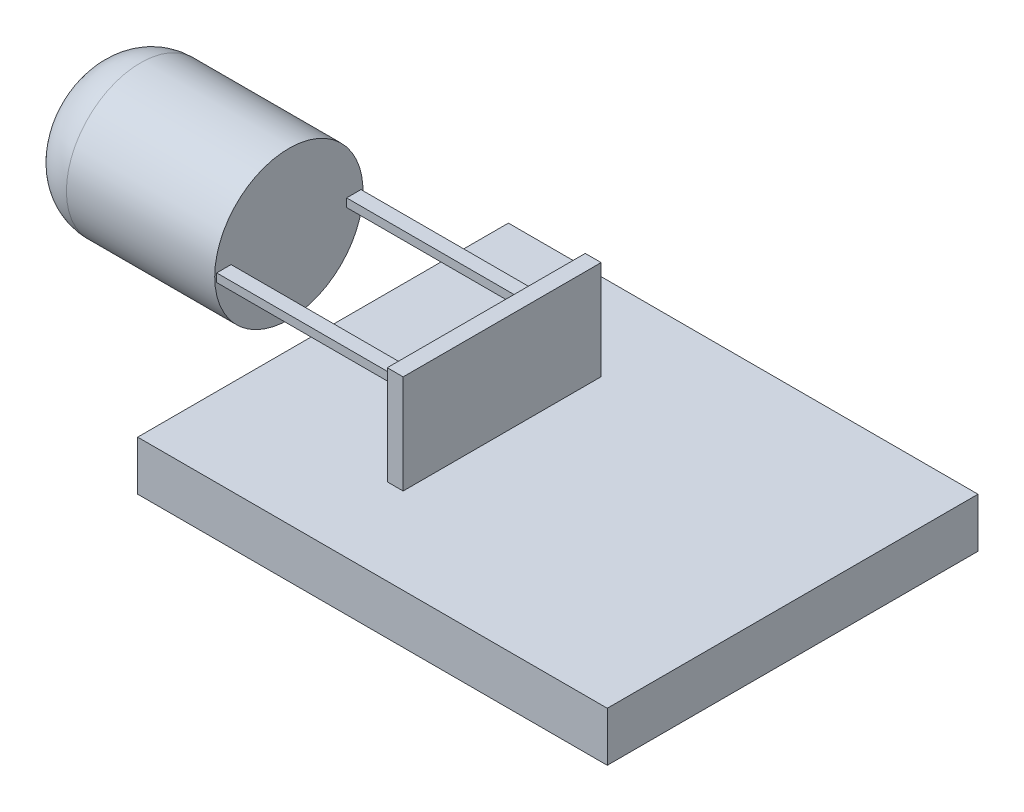
ISO-10303-21;
HEADER;
FILE_DESCRIPTION(('STEP AP214'),'2;1');
FILE_NAME('part.step','',(''),(''),'','','');
FILE_SCHEMA(('AUTOMOTIVE_DESIGN { 1 0 10303 214 1 1 1 1 }'));
ENDSEC;
DATA;
#1=APPLICATION_CONTEXT('core data for automotive mechanical design processes');
#2=APPLICATION_PROTOCOL_DEFINITION('international standard','automotive_design',2000,#1);
#3=PRODUCT_CONTEXT('',#1,'mechanical');
#4=PRODUCT('Part','Part','',(#3));
#5=PRODUCT_RELATED_PRODUCT_CATEGORY('part','',(#4));
#6=PRODUCT_DEFINITION_FORMATION('','',#4);
#7=PRODUCT_DEFINITION_CONTEXT('part definition',#1,'design');
#8=PRODUCT_DEFINITION('design','',#6,#7);
#9=PRODUCT_DEFINITION_SHAPE('','',#8);
#10=(LENGTH_UNIT() NAMED_UNIT(*) SI_UNIT(.MILLI.,.METRE.));
#11=(NAMED_UNIT(*) PLANE_ANGLE_UNIT() SI_UNIT($,.RADIAN.));
#12=(NAMED_UNIT(*) SI_UNIT($,.STERADIAN.) SOLID_ANGLE_UNIT());
#13=UNCERTAINTY_MEASURE_WITH_UNIT(LENGTH_MEASURE(1.E-05),#10,'distance_accuracy_value','');
#14=(GEOMETRIC_REPRESENTATION_CONTEXT(3) GLOBAL_UNCERTAINTY_ASSIGNED_CONTEXT((#13)) GLOBAL_UNIT_ASSIGNED_CONTEXT((#10,
#11,#12)) REPRESENTATION_CONTEXT('',''));
#15=CARTESIAN_POINT('',(0.,0.,0.));
#16=DIRECTION('',(0.,0.,1.));
#17=DIRECTION('',(1.,0.,0.));
#18=AXIS2_PLACEMENT_3D('',#15,#16,#17);
#19=CARTESIAN_POINT('',(-2.8834257747241,6.,4.01836179610576));
#20=DIRECTION('',(1.,0.,0.));
#21=DIRECTION('',(0.,0.,-1.));
#22=AXIS2_PLACEMENT_3D('',#19,#20,#21);
#23=PLANE('',#22);
#24=DIRECTION('',(0.,0.,1.));
#25=VECTOR('',#24,1.);
#26=CARTESIAN_POINT('',(-2.8834257747241,4.77290766753286,2.91860664881381));
#27=LINE('',#26,#25);
#28=CARTESIAN_POINT('',(-2.8834257747241,4.77290766753286,2.33811029877349));
#29=VERTEX_POINT('',#28);
#30=CARTESIAN_POINT('',(-2.8834257747241,4.77290766753286,2.91860664881381));
#31=VERTEX_POINT('',#30);
#32=EDGE_CURVE('E196',#29,#31,#27,.T.);
#33=ORIENTED_EDGE('',*,*,#32,.T.);
#34=DIRECTION('',(0.,-1.,0.));
#35=VECTOR('',#34,1.);
#36=CARTESIAN_POINT('',(-2.8834257747241,4.77290766753286,2.91860664881381));
#37=LINE('',#36,#35);
#38=CARTESIAN_POINT('',(-2.8834257747241,4.434284796676,2.91860664881381));
#39=VERTEX_POINT('',#38);
#40=EDGE_CURVE('E193',#31,#39,#37,.T.);
#41=ORIENTED_EDGE('',*,*,#40,.T.);
#42=DIRECTION('',(0.,0.,-1.));
#43=VECTOR('',#42,1.);
#44=CARTESIAN_POINT('',(-2.8834257747241,4.434284796676,2.91860664881381));
#45=LINE('',#44,#43);
#46=CARTESIAN_POINT('',(-2.8834257747241,4.434284796676,2.33811029877349));
#47=VERTEX_POINT('',#46);
#48=EDGE_CURVE('E171',#39,#47,#45,.T.);
#49=ORIENTED_EDGE('',*,*,#48,.T.);
#50=DIRECTION('',(0.,1.,0.));
#51=VECTOR('',#50,1.);
#52=CARTESIAN_POINT('',(-2.8834257747241,4.77290766753286,2.33811029877349));
#53=LINE('',#52,#51);
#54=EDGE_CURVE('E57',#47,#29,#53,.T.);
#55=ORIENTED_EDGE('',*,*,#54,.T.);
#56=EDGE_LOOP('',(#33,#41,#49,#55));
#57=FACE_BOUND('',#56,.T.);
#58=DIRECTION('',(0.,0.,1.));
#59=VECTOR('',#58,1.);
#60=CARTESIAN_POINT('',(-2.8834257747241,2.,4.01836179610576));
#61=LINE('',#60,#59);
#62=CARTESIAN_POINT('',(-2.8834257747241,2.,-3.99281168269362));
#63=VERTEX_POINT('',#62);
#64=CARTESIAN_POINT('',(-2.8834257747241,2.,4.01836179610576));
#65=VERTEX_POINT('',#64);
#66=EDGE_CURVE('E254',#63,#65,#61,.T.);
#67=ORIENTED_EDGE('',*,*,#66,.T.);
#68=DIRECTION('',(0.,-1.,0.));
#69=VECTOR('',#68,1.);
#70=CARTESIAN_POINT('',(-2.8834257747241,6.,4.01836179610576));
#71=LINE('',#70,#69);
#72=CARTESIAN_POINT('',(-2.8834257747241,6.,4.01836179610576));
#73=VERTEX_POINT('',#72);
#74=EDGE_CURVE('E292',#73,#65,#71,.T.);
#75=ORIENTED_EDGE('',*,*,#74,.F.);
#76=DIRECTION('',(0.,0.,1.));
#77=VECTOR('',#76,1.);
#78=CARTESIAN_POINT('',(-2.8834257747241,6.,4.01836179610576));
#79=LINE('',#78,#77);
#80=CARTESIAN_POINT('',(-2.8834257747241,6.,-3.99281168269362));
#81=VERTEX_POINT('',#80);
#82=EDGE_CURVE('E255',#81,#73,#79,.T.);
#83=ORIENTED_EDGE('',*,*,#82,.F.);
#84=DIRECTION('',(0.,-1.,0.));
#85=VECTOR('',#84,1.);
#86=CARTESIAN_POINT('',(-2.8834257747241,6.,-3.99281168269362));
#87=LINE('',#86,#85);
#88=EDGE_CURVE('E269',#81,#63,#87,.T.);
#89=ORIENTED_EDGE('',*,*,#88,.T.);
#90=EDGE_LOOP('',(#67,#75,#83,#89));
#91=FACE_BOUND('',#90,.T.);
#92=DIRECTION('',(0.,-1.,0.));
#93=VECTOR('',#92,1.);
#94=CARTESIAN_POINT('',(-2.8834257747241,4.77290766753286,-2.91860664881381));
#95=LINE('',#94,#93);
#96=CARTESIAN_POINT('',(-2.8834257747241,4.77290766753286,-2.91860664881381));
#97=VERTEX_POINT('',#96);
#98=CARTESIAN_POINT('',(-2.8834257747241,4.434284796676,-2.91860664881381));
#99=VERTEX_POINT('',#98);
#100=EDGE_CURVE('E209',#97,#99,#95,.T.);
#101=ORIENTED_EDGE('',*,*,#100,.F.);
#102=DIRECTION('',(0.,0.,-1.));
#103=VECTOR('',#102,1.);
#104=CARTESIAN_POINT('',(-2.8834257747241,4.77290766753286,-2.91860664881381));
#105=LINE('',#104,#103);
#106=CARTESIAN_POINT('',(-2.8834257747241,4.77290766753286,-2.33811029877349));
#107=VERTEX_POINT('',#106);
#108=EDGE_CURVE('E215',#107,#97,#105,.T.);
#109=ORIENTED_EDGE('',*,*,#108,.F.);
#110=DIRECTION('',(0.,1.,0.));
#111=VECTOR('',#110,1.);
#112=CARTESIAN_POINT('',(-2.8834257747241,4.77290766753286,-2.33811029877349));
#113=LINE('',#112,#111);
#114=CARTESIAN_POINT('',(-2.8834257747241,4.434284796676,-2.33811029877349));
#115=VERTEX_POINT('',#114);
#116=EDGE_CURVE('E233',#115,#107,#113,.T.);
#117=ORIENTED_EDGE('',*,*,#116,.F.);
#118=DIRECTION('',(0.,0.,1.));
#119=VECTOR('',#118,1.);
#120=CARTESIAN_POINT('',(-2.8834257747241,4.434284796676,-2.91860664881381));
#121=LINE('',#120,#119);
#122=EDGE_CURVE('E65',#99,#115,#121,.T.);
#123=ORIENTED_EDGE('',*,*,#122,.F.);
#124=EDGE_LOOP('',(#101,#109,#117,#123));
#125=FACE_BOUND('',#124,.T.);
#126=ADVANCED_FACE('F41',(#57,#91,#125),#23,.F.);
#127=CARTESIAN_POINT('',(0.,2.,0.));
#128=DIRECTION('',(0.,1.,0.));
#129=DIRECTION('',(0.,0.,1.));
#130=AXIS2_PLACEMENT_3D('',#127,#128,#129);
#131=PLANE('',#130);
#132=DIRECTION('',(0.,0.,-1.));
#133=VECTOR('',#132,1.);
#134=CARTESIAN_POINT('',(9.5,2.,-7.5));
#135=LINE('',#134,#133);
#136=CARTESIAN_POINT('',(9.5,2.,7.5));
#137=VERTEX_POINT('',#136);
#138=CARTESIAN_POINT('',(9.5,2.,-7.5));
#139=VERTEX_POINT('',#138);
#140=EDGE_CURVE('E296',#137,#139,#135,.T.);
#141=ORIENTED_EDGE('',*,*,#140,.T.);
#142=DIRECTION('',(-1.,0.,0.));
#143=VECTOR('',#142,1.);
#144=CARTESIAN_POINT('',(-9.5,2.,-7.5));
#145=LINE('',#144,#143);
#146=CARTESIAN_POINT('',(-9.5,2.,-7.5));
#147=VERTEX_POINT('',#146);
#148=EDGE_CURVE('E300',#139,#147,#145,.T.);
#149=ORIENTED_EDGE('',*,*,#148,.T.);
#150=DIRECTION('',(0.,0.,1.));
#151=VECTOR('',#150,1.);
#152=CARTESIAN_POINT('',(-9.5,2.,-7.5));
#153=LINE('',#152,#151);
#154=CARTESIAN_POINT('',(-9.5,2.,7.5));
#155=VERTEX_POINT('',#154);
#156=EDGE_CURVE('E304',#147,#155,#153,.T.);
#157=ORIENTED_EDGE('',*,*,#156,.T.);
#158=DIRECTION('',(1.,0.,0.));
#159=VECTOR('',#158,1.);
#160=CARTESIAN_POINT('',(-9.5,2.,7.5));
#161=LINE('',#160,#159);
#162=EDGE_CURVE('E307',#155,#137,#161,.T.);
#163=ORIENTED_EDGE('',*,*,#162,.T.);
#164=EDGE_LOOP('',(#141,#149,#157,#163));
#165=FACE_BOUND('',#164,.T.);
#166=DIRECTION('',(1.,0.,0.));
#167=VECTOR('',#166,1.);
#168=CARTESIAN_POINT('',(-2.8834257747241,2.,4.01836179610576));
#169=LINE('',#168,#167);
#170=CARTESIAN_POINT('',(-2.24092564609859,2.,4.01836179610576));
#171=VERTEX_POINT('',#170);
#172=EDGE_CURVE('E273',#65,#171,#169,.T.);
#173=ORIENTED_EDGE('',*,*,#172,.F.);
#174=ORIENTED_EDGE('',*,*,#66,.F.);
#175=DIRECTION('',(-1.,0.,0.));
#176=VECTOR('',#175,1.);
#177=CARTESIAN_POINT('',(-2.8834257747241,2.,-3.99281168269362));
#178=LINE('',#177,#176);
#179=CARTESIAN_POINT('',(-2.24092564609859,2.,-3.99281168269362));
#180=VERTEX_POINT('',#179);
#181=EDGE_CURVE('E260',#180,#63,#178,.T.);
#182=ORIENTED_EDGE('',*,*,#181,.F.);
#183=DIRECTION('',(0.,0.,-1.));
#184=VECTOR('',#183,1.);
#185=CARTESIAN_POINT('',(-2.24092564609859,2.,4.01836179610576));
#186=LINE('',#185,#184);
#187=EDGE_CURVE('E276',#171,#180,#186,.T.);
#188=ORIENTED_EDGE('',*,*,#187,.F.);
#189=EDGE_LOOP('',(#173,#174,#182,#188));
#190=FACE_BOUND('',#189,.T.);
#191=ADVANCED_FACE('F351',(#165,#190),#131,.T.);
#192=CARTESIAN_POINT('',(9.5,2.,-7.5));
#193=DIRECTION('',(-1.,0.,0.));
#194=DIRECTION('',(0.,0.,1.));
#195=AXIS2_PLACEMENT_3D('',#192,#193,#194);
#196=PLANE('',#195);
#197=DIRECTION('',(0.,0.,-1.));
#198=VECTOR('',#197,1.);
#199=CARTESIAN_POINT('',(9.5,0.,-7.5));
#200=LINE('',#199,#198);
#201=CARTESIAN_POINT('',(9.5,0.,7.5));
#202=VERTEX_POINT('',#201);
#203=CARTESIAN_POINT('',(9.5,0.,-7.5));
#204=VERTEX_POINT('',#203);
#205=EDGE_CURVE('E295',#202,#204,#200,.T.);
#206=ORIENTED_EDGE('',*,*,#205,.T.);
#207=DIRECTION('',(0.,-1.,0.));
#208=VECTOR('',#207,1.);
#209=CARTESIAN_POINT('',(9.5,2.,-7.5));
#210=LINE('',#209,#208);
#211=EDGE_CURVE('E333',#139,#204,#210,.T.);
#212=ORIENTED_EDGE('',*,*,#211,.F.);
#213=ORIENTED_EDGE('',*,*,#140,.F.);
#214=DIRECTION('',(0.,-1.,0.));
#215=VECTOR('',#214,1.);
#216=CARTESIAN_POINT('',(9.5,2.,7.5));
#217=LINE('',#216,#215);
#218=EDGE_CURVE('E310',#137,#202,#217,.T.);
#219=ORIENTED_EDGE('',*,*,#218,.T.);
#220=EDGE_LOOP('',(#206,#212,#213,#219));
#221=FACE_BOUND('',#220,.T.);
#222=ADVANCED_FACE('F357',(#221),#196,.F.);
#223=CARTESIAN_POINT('',(-9.5,2.,-7.5));
#224=DIRECTION('',(0.,0.,1.));
#225=DIRECTION('',(1.,0.,0.));
#226=AXIS2_PLACEMENT_3D('',#223,#224,#225);
#227=PLANE('',#226);
#228=DIRECTION('',(-1.,0.,0.));
#229=VECTOR('',#228,1.);
#230=CARTESIAN_POINT('',(-9.5,0.,-7.5));
#231=LINE('',#230,#229);
#232=CARTESIAN_POINT('',(-9.5,0.,-7.5));
#233=VERTEX_POINT('',#232);
#234=EDGE_CURVE('E314',#204,#233,#231,.T.);
#235=ORIENTED_EDGE('',*,*,#234,.T.);
#236=DIRECTION('',(0.,-1.,0.));
#237=VECTOR('',#236,1.);
#238=CARTESIAN_POINT('',(-9.5,2.,-7.5));
#239=LINE('',#238,#237);
#240=EDGE_CURVE('E329',#147,#233,#239,.T.);
#241=ORIENTED_EDGE('',*,*,#240,.F.);
#242=ORIENTED_EDGE('',*,*,#148,.F.);
#243=ORIENTED_EDGE('',*,*,#211,.T.);
#244=EDGE_LOOP('',(#235,#241,#242,#243));
#245=FACE_BOUND('',#244,.T.);
#246=ADVANCED_FACE('F376',(#245),#227,.F.);
#247=CARTESIAN_POINT('',(-9.5,2.,-7.5));
#248=DIRECTION('',(1.,0.,0.));
#249=DIRECTION('',(0.,0.,-1.));
#250=AXIS2_PLACEMENT_3D('',#247,#248,#249);
#251=PLANE('',#250);
#252=DIRECTION('',(0.,0.,1.));
#253=VECTOR('',#252,1.);
#254=CARTESIAN_POINT('',(-9.5,0.,-7.5));
#255=LINE('',#254,#253);
#256=CARTESIAN_POINT('',(-9.5,0.,7.5));
#257=VERTEX_POINT('',#256);
#258=EDGE_CURVE('E317',#233,#257,#255,.T.);
#259=ORIENTED_EDGE('',*,*,#258,.T.);
#260=DIRECTION('',(0.,-1.,0.));
#261=VECTOR('',#260,1.);
#262=CARTESIAN_POINT('',(-9.5,2.,7.5));
#263=LINE('',#262,#261);
#264=EDGE_CURVE('E325',#155,#257,#263,.T.);
#265=ORIENTED_EDGE('',*,*,#264,.F.);
#266=ORIENTED_EDGE('',*,*,#156,.F.);
#267=ORIENTED_EDGE('',*,*,#240,.T.);
#268=EDGE_LOOP('',(#259,#265,#266,#267));
#269=FACE_BOUND('',#268,.T.);
#270=ADVANCED_FACE('F372',(#269),#251,.F.);
#271=CARTESIAN_POINT('',(-9.5,2.,7.5));
#272=DIRECTION('',(0.,0.,-1.));
#273=DIRECTION('',(-1.,0.,0.));
#274=AXIS2_PLACEMENT_3D('',#271,#272,#273);
#275=PLANE('',#274);
#276=DIRECTION('',(1.,0.,0.));
#277=VECTOR('',#276,1.);
#278=CARTESIAN_POINT('',(-9.5,0.,7.5));
#279=LINE('',#278,#277);
#280=EDGE_CURVE('E301',#257,#202,#279,.T.);
#281=ORIENTED_EDGE('',*,*,#280,.T.);
#282=ORIENTED_EDGE('',*,*,#218,.F.);
#283=ORIENTED_EDGE('',*,*,#162,.F.);
#284=ORIENTED_EDGE('',*,*,#264,.T.);
#285=EDGE_LOOP('',(#281,#282,#283,#284));
#286=FACE_BOUND('',#285,.T.);
#287=ADVANCED_FACE('F368',(#286),#275,.F.);
#288=CARTESIAN_POINT('',(0.,0.,0.));
#289=DIRECTION('',(0.,1.,0.));
#290=DIRECTION('',(0.,0.,1.));
#291=AXIS2_PLACEMENT_3D('',#288,#289,#290);
#292=PLANE('',#291);
#293=ORIENTED_EDGE('',*,*,#205,.F.);
#294=ORIENTED_EDGE('',*,*,#280,.F.);
#295=ORIENTED_EDGE('',*,*,#258,.F.);
#296=ORIENTED_EDGE('',*,*,#234,.F.);
#297=EDGE_LOOP('',(#293,#294,#295,#296));
#298=FACE_BOUND('',#297,.T.);
#299=ADVANCED_FACE('F365',(#298),#292,.F.);
#300=CARTESIAN_POINT('',(-2.8834257747241,6.,4.01836179610576));
#301=DIRECTION('',(0.,0.,-1.));
#302=DIRECTION('',(-1.,0.,0.));
#303=AXIS2_PLACEMENT_3D('',#300,#301,#302);
#304=PLANE('',#303);
#305=ORIENTED_EDGE('',*,*,#172,.T.);
#306=DIRECTION('',(0.,-1.,0.));
#307=VECTOR('',#306,1.);
#308=CARTESIAN_POINT('',(-2.24092564609859,6.,4.01836179610576));
#309=LINE('',#308,#307);
#310=CARTESIAN_POINT('',(-2.24092564609859,6.,4.01836179610576));
#311=VERTEX_POINT('',#310);
#312=EDGE_CURVE('E288',#311,#171,#309,.T.);
#313=ORIENTED_EDGE('',*,*,#312,.F.);
#314=DIRECTION('',(1.,0.,0.));
#315=VECTOR('',#314,1.);
#316=CARTESIAN_POINT('',(-2.8834257747241,6.,4.01836179610576));
#317=LINE('',#316,#315);
#318=EDGE_CURVE('E259',#73,#311,#317,.T.);
#319=ORIENTED_EDGE('',*,*,#318,.F.);
#320=ORIENTED_EDGE('',*,*,#74,.T.);
#321=EDGE_LOOP('',(#305,#313,#319,#320));
#322=FACE_BOUND('',#321,.T.);
#323=ADVANCED_FACE('F362',(#322),#304,.F.);
#324=CARTESIAN_POINT('',(-2.24092564609859,6.,4.01836179610576));
#325=DIRECTION('',(-1.,0.,0.));
#326=DIRECTION('',(0.,0.,1.));
#327=AXIS2_PLACEMENT_3D('',#324,#325,#326);
#328=PLANE('',#327);
#329=ORIENTED_EDGE('',*,*,#187,.T.);
#330=DIRECTION('',(0.,-1.,0.));
#331=VECTOR('',#330,1.);
#332=CARTESIAN_POINT('',(-2.24092564609859,6.,-3.99281168269362));
#333=LINE('',#332,#331);
#334=CARTESIAN_POINT('',(-2.24092564609859,6.,-3.99281168269362));
#335=VERTEX_POINT('',#334);
#336=EDGE_CURVE('E285',#335,#180,#333,.T.);
#337=ORIENTED_EDGE('',*,*,#336,.F.);
#338=DIRECTION('',(0.,0.,-1.));
#339=VECTOR('',#338,1.);
#340=CARTESIAN_POINT('',(-2.24092564609859,6.,4.01836179610576));
#341=LINE('',#340,#339);
#342=EDGE_CURVE('E263',#311,#335,#341,.T.);
#343=ORIENTED_EDGE('',*,*,#342,.F.);
#344=ORIENTED_EDGE('',*,*,#312,.T.);
#345=EDGE_LOOP('',(#329,#337,#343,#344));
#346=FACE_BOUND('',#345,.T.);
#347=ADVANCED_FACE('F404',(#346),#328,.F.);
#348=CARTESIAN_POINT('',(-2.8834257747241,6.,-3.99281168269362));
#349=DIRECTION('',(0.,0.,1.));
#350=DIRECTION('',(1.,0.,0.));
#351=AXIS2_PLACEMENT_3D('',#348,#349,#350);
#352=PLANE('',#351);
#353=ORIENTED_EDGE('',*,*,#181,.T.);
#354=ORIENTED_EDGE('',*,*,#88,.F.);
#355=DIRECTION('',(-1.,0.,0.));
#356=VECTOR('',#355,1.);
#357=CARTESIAN_POINT('',(-2.8834257747241,6.,-3.99281168269362));
#358=LINE('',#357,#356);
#359=EDGE_CURVE('E266',#335,#81,#358,.T.);
#360=ORIENTED_EDGE('',*,*,#359,.F.);
#361=ORIENTED_EDGE('',*,*,#336,.T.);
#362=EDGE_LOOP('',(#353,#354,#360,#361));
#363=FACE_BOUND('',#362,.T.);
#364=ADVANCED_FACE('F412',(#363),#352,.F.);
#365=CARTESIAN_POINT('',(0.,6.,0.));
#366=DIRECTION('',(0.,-1.,0.));
#367=DIRECTION('',(0.,0.,-1.));
#368=AXIS2_PLACEMENT_3D('',#365,#366,#367);
#369=PLANE('',#368);
#370=ORIENTED_EDGE('',*,*,#82,.T.);
#371=ORIENTED_EDGE('',*,*,#318,.T.);
#372=ORIENTED_EDGE('',*,*,#342,.T.);
#373=ORIENTED_EDGE('',*,*,#359,.T.);
#374=EDGE_LOOP('',(#370,#371,#372,#373));
#375=FACE_BOUND('',#374,.T.);
#376=ADVANCED_FACE('F408',(#375),#369,.F.);
#377=CARTESIAN_POINT('',(-10.8834257747241,4.77290766753286,-2.91860664881381));
#378=DIRECTION('',(0.,0.,1.));
#379=DIRECTION('',(1.,0.,0.));
#380=AXIS2_PLACEMENT_3D('',#377,#378,#379);
#381=PLANE('',#380);
#382=ORIENTED_EDGE('',*,*,#100,.T.);
#383=DIRECTION('',(1.,0.,0.));
#384=VECTOR('',#383,1.);
#385=CARTESIAN_POINT('',(-10.8834257747241,4.434284796676,-2.91860664881381));
#386=LINE('',#385,#384);
#387=CARTESIAN_POINT('',(-10.8834257747241,4.434284796676,-2.91860664881381));
#388=VERTEX_POINT('',#387);
#389=EDGE_CURVE('E251',#388,#99,#386,.T.);
#390=ORIENTED_EDGE('',*,*,#389,.F.);
#391=DIRECTION('',(0.,-1.,0.));
#392=VECTOR('',#391,1.);
#393=CARTESIAN_POINT('',(-10.8834257747241,4.77290766753286,-2.91860664881381));
#394=LINE('',#393,#392);
#395=CARTESIAN_POINT('',(-10.8834257747241,4.77290766753286,-2.91860664881381));
#396=VERTEX_POINT('',#395);
#397=EDGE_CURVE('E210',#396,#388,#394,.T.);
#398=ORIENTED_EDGE('',*,*,#397,.F.);
#399=DIRECTION('',(1.,0.,0.));
#400=VECTOR('',#399,1.);
#401=CARTESIAN_POINT('',(-10.8834257747241,4.77290766753286,-2.91860664881381));
#402=LINE('',#401,#400);
#403=EDGE_CURVE('E227',#396,#97,#402,.T.);
#404=ORIENTED_EDGE('',*,*,#403,.T.);
#405=EDGE_LOOP('',(#382,#390,#398,#404));
#406=FACE_BOUND('',#405,.T.);
#407=ADVANCED_FACE('F419',(#406),#381,.F.);
#408=CARTESIAN_POINT('',(-10.8834257747241,4.434284796676,-2.91860664881381));
#409=DIRECTION('',(0.,1.,0.));
#410=DIRECTION('',(0.,0.,1.));
#411=AXIS2_PLACEMENT_3D('',#408,#409,#410);
#412=PLANE('',#411);
#413=ORIENTED_EDGE('',*,*,#122,.T.);
#414=DIRECTION('',(1.,0.,0.));
#415=VECTOR('',#414,1.);
#416=CARTESIAN_POINT('',(-10.8834257747241,4.434284796676,-2.33811029877349));
#417=LINE('',#416,#415);
#418=CARTESIAN_POINT('',(-10.8834257747241,4.434284796676,-2.33811029877349));
#419=VERTEX_POINT('',#418);
#420=EDGE_CURVE('E247',#419,#115,#417,.T.);
#421=ORIENTED_EDGE('',*,*,#420,.F.);
#422=DIRECTION('',(0.,0.,1.));
#423=VECTOR('',#422,1.);
#424=CARTESIAN_POINT('',(-10.8834257747241,4.434284796676,-2.91860664881381));
#425=LINE('',#424,#423);
#426=EDGE_CURVE('E214',#388,#419,#425,.T.);
#427=ORIENTED_EDGE('',*,*,#426,.F.);
#428=ORIENTED_EDGE('',*,*,#389,.T.);
#429=EDGE_LOOP('',(#413,#421,#427,#428));
#430=FACE_BOUND('',#429,.T.);
#431=ADVANCED_FACE('F424',(#430),#412,.F.);
#432=CARTESIAN_POINT('',(-10.8834257747241,4.77290766753286,-2.33811029877349));
#433=DIRECTION('',(0.,0.,-1.));
#434=DIRECTION('',(-1.,0.,0.));
#435=AXIS2_PLACEMENT_3D('',#432,#433,#434);
#436=PLANE('',#435);
#437=ORIENTED_EDGE('',*,*,#116,.T.);
#438=DIRECTION('',(1.,0.,0.));
#439=VECTOR('',#438,1.);
#440=CARTESIAN_POINT('',(-10.8834257747241,4.77290766753286,-2.33811029877349));
#441=LINE('',#440,#439);
#442=CARTESIAN_POINT('',(-10.8834257747241,4.77290766753286,-2.33811029877349));
#443=VERTEX_POINT('',#442);
#444=EDGE_CURVE('E243',#443,#107,#441,.T.);
#445=ORIENTED_EDGE('',*,*,#444,.F.);
#446=DIRECTION('',(0.,1.,0.));
#447=VECTOR('',#446,1.);
#448=CARTESIAN_POINT('',(-10.8834257747241,4.77290766753286,-2.33811029877349));
#449=LINE('',#448,#447);
#450=EDGE_CURVE('E219',#419,#443,#449,.T.);
#451=ORIENTED_EDGE('',*,*,#450,.F.);
#452=ORIENTED_EDGE('',*,*,#420,.T.);
#453=EDGE_LOOP('',(#437,#445,#451,#452));
#454=FACE_BOUND('',#453,.T.);
#455=ADVANCED_FACE('F428',(#454),#436,.F.);
#456=CARTESIAN_POINT('',(-10.8834257747241,4.77290766753286,-2.91860664881381));
#457=DIRECTION('',(0.,-1.,0.));
#458=DIRECTION('',(0.,0.,-1.));
#459=AXIS2_PLACEMENT_3D('',#456,#457,#458);
#460=PLANE('',#459);
#461=ORIENTED_EDGE('',*,*,#108,.T.);
#462=ORIENTED_EDGE('',*,*,#403,.F.);
#463=DIRECTION('',(0.,0.,-1.));
#464=VECTOR('',#463,1.);
#465=CARTESIAN_POINT('',(-10.8834257747241,4.77290766753286,-2.91860664881381));
#466=LINE('',#465,#464);
#467=EDGE_CURVE('E223',#443,#396,#466,.T.);
#468=ORIENTED_EDGE('',*,*,#467,.F.);
#469=ORIENTED_EDGE('',*,*,#444,.T.);
#470=EDGE_LOOP('',(#461,#462,#468,#469));
#471=FACE_BOUND('',#470,.T.);
#472=ADVANCED_FACE('F432',(#471),#460,.F.);
#473=CARTESIAN_POINT('',(-10.8834257747241,4.77290766753286,2.91860664881381));
#474=DIRECTION('',(0.,0.,1.));
#475=DIRECTION('',(1.,0.,0.));
#476=AXIS2_PLACEMENT_3D('',#473,#474,#475);
#477=PLANE('',#476);
#478=ORIENTED_EDGE('',*,*,#40,.F.);
#479=DIRECTION('',(1.,0.,0.));
#480=VECTOR('',#479,1.);
#481=CARTESIAN_POINT('',(-10.8834257747241,4.77290766753286,2.91860664881381));
#482=LINE('',#481,#480);
#483=CARTESIAN_POINT('',(-10.8834257747241,4.77290766753286,2.91860664881381));
#484=VERTEX_POINT('',#483);
#485=EDGE_CURVE('E179',#484,#31,#482,.T.);
#486=ORIENTED_EDGE('',*,*,#485,.F.);
#487=DIRECTION('',(0.,-1.,0.));
#488=VECTOR('',#487,1.);
#489=CARTESIAN_POINT('',(-10.8834257747241,4.77290766753286,2.91860664881381));
#490=LINE('',#489,#488);
#491=CARTESIAN_POINT('',(-10.8834257747241,4.434284796676,2.91860664881381));
#492=VERTEX_POINT('',#491);
#493=EDGE_CURVE('E160',#484,#492,#490,.T.);
#494=ORIENTED_EDGE('',*,*,#493,.T.);
#495=DIRECTION('',(1.,0.,0.));
#496=VECTOR('',#495,1.);
#497=CARTESIAN_POINT('',(-10.8834257747241,4.434284796676,2.91860664881381));
#498=LINE('',#497,#496);
#499=EDGE_CURVE('E166',#492,#39,#498,.T.);
#500=ORIENTED_EDGE('',*,*,#499,.T.);
#501=EDGE_LOOP('',(#478,#486,#494,#500));
#502=FACE_BOUND('',#501,.T.);
#503=ADVANCED_FACE('F178',(#502),#477,.T.);
#504=CARTESIAN_POINT('',(-10.8834257747241,4.77290766753286,2.91860664881381));
#505=DIRECTION('',(0.,1.,0.));
#506=DIRECTION('',(0.,0.,1.));
#507=AXIS2_PLACEMENT_3D('',#504,#505,#506);
#508=PLANE('',#507);
#509=ORIENTED_EDGE('',*,*,#32,.F.);
#510=DIRECTION('',(1.,0.,0.));
#511=VECTOR('',#510,1.);
#512=CARTESIAN_POINT('',(-10.8834257747241,4.77290766753286,2.33811029877349));
#513=LINE('',#512,#511);
#514=CARTESIAN_POINT('',(-10.8834257747241,4.77290766753286,2.33811029877349));
#515=VERTEX_POINT('',#514);
#516=EDGE_CURVE('E204',#515,#29,#513,.T.);
#517=ORIENTED_EDGE('',*,*,#516,.F.);
#518=DIRECTION('',(0.,0.,1.));
#519=VECTOR('',#518,1.);
#520=CARTESIAN_POINT('',(-10.8834257747241,4.77290766753286,2.91860664881381));
#521=LINE('',#520,#519);
#522=EDGE_CURVE('E182',#515,#484,#521,.T.);
#523=ORIENTED_EDGE('',*,*,#522,.T.);
#524=ORIENTED_EDGE('',*,*,#485,.T.);
#525=EDGE_LOOP('',(#509,#517,#523,#524));
#526=FACE_BOUND('',#525,.T.);
#527=ADVANCED_FACE('F439',(#526),#508,.T.);
#528=CARTESIAN_POINT('',(-10.8834257747241,4.77290766753286,2.33811029877349));
#529=DIRECTION('',(0.,0.,-1.));
#530=DIRECTION('',(-1.,0.,0.));
#531=AXIS2_PLACEMENT_3D('',#528,#529,#530);
#532=PLANE('',#531);
#533=ORIENTED_EDGE('',*,*,#54,.F.);
#534=DIRECTION('',(1.,0.,0.));
#535=VECTOR('',#534,1.);
#536=CARTESIAN_POINT('',(-10.8834257747241,4.434284796676,2.33811029877349));
#537=LINE('',#536,#535);
#538=CARTESIAN_POINT('',(-10.8834257747241,4.434284796676,2.33811029877349));
#539=VERTEX_POINT('',#538);
#540=EDGE_CURVE('E176',#539,#47,#537,.T.);
#541=ORIENTED_EDGE('',*,*,#540,.F.);
#542=DIRECTION('',(0.,1.,0.));
#543=VECTOR('',#542,1.);
#544=CARTESIAN_POINT('',(-10.8834257747241,4.77290766753286,2.33811029877349));
#545=LINE('',#544,#543);
#546=EDGE_CURVE('E163',#539,#515,#545,.T.);
#547=ORIENTED_EDGE('',*,*,#546,.T.);
#548=ORIENTED_EDGE('',*,*,#516,.T.);
#549=EDGE_LOOP('',(#533,#541,#547,#548));
#550=FACE_BOUND('',#549,.T.);
#551=ADVANCED_FACE('F442',(#550),#532,.T.);
#552=CARTESIAN_POINT('',(-10.8834257747241,4.434284796676,2.91860664881381));
#553=DIRECTION('',(0.,-1.,0.));
#554=DIRECTION('',(0.,0.,-1.));
#555=AXIS2_PLACEMENT_3D('',#552,#553,#554);
#556=PLANE('',#555);
#557=ORIENTED_EDGE('',*,*,#48,.F.);
#558=ORIENTED_EDGE('',*,*,#499,.F.);
#559=DIRECTION('',(0.,0.,-1.));
#560=VECTOR('',#559,1.);
#561=CARTESIAN_POINT('',(-10.8834257747241,4.434284796676,2.91860664881381));
#562=LINE('',#561,#560);
#563=EDGE_CURVE('E155',#492,#539,#562,.T.);
#564=ORIENTED_EDGE('',*,*,#563,.T.);
#565=ORIENTED_EDGE('',*,*,#540,.T.);
#566=EDGE_LOOP('',(#557,#558,#564,#565));
#567=FACE_BOUND('',#566,.T.);
#568=ADVANCED_FACE('F169',(#567),#556,.T.);
#569=CARTESIAN_POINT('',(-10.8834257747241,4.6763273697996,0.));
#570=DIRECTION('',(-1.,0.,0.));
#571=DIRECTION('',(0.,0.,1.));
#572=AXIS2_PLACEMENT_3D('',#569,#570,#571);
#573=PLANE('',#572);
#574=ORIENTED_EDGE('',*,*,#493,.F.);
#575=ORIENTED_EDGE('',*,*,#522,.F.);
#576=ORIENTED_EDGE('',*,*,#546,.F.);
#577=ORIENTED_EDGE('',*,*,#563,.F.);
#578=EDGE_LOOP('',(#574,#575,#576,#577));
#579=FACE_BOUND('',#578,.T.);
#580=CARTESIAN_POINT('',(-10.8834257747241,4.6763273697996,0.));
#581=DIRECTION('',(-1.,0.,0.));
#582=DIRECTION('',(0.,0.,1.));
#583=AXIS2_PLACEMENT_3D('',#580,#581,#582);
#584=CIRCLE('',#583,3.);
#585=CARTESIAN_POINT('',(-10.8834257747241,4.6763273697996,3.));
#586=VERTEX_POINT('',#585);
#587=EDGE_CURVE('E189',#586,#586,#584,.T.);
#588=ORIENTED_EDGE('',*,*,#587,.F.);
#589=EDGE_LOOP('',(#588));
#590=FACE_BOUND('',#589,.T.);
#591=ORIENTED_EDGE('',*,*,#467,.T.);
#592=ORIENTED_EDGE('',*,*,#397,.T.);
#593=ORIENTED_EDGE('',*,*,#426,.T.);
#594=ORIENTED_EDGE('',*,*,#450,.T.);
#595=EDGE_LOOP('',(#591,#592,#593,#594));
#596=FACE_BOUND('',#595,.T.);
#597=ADVANCED_FACE('F157',(#579,#590,#596),#573,.F.);
#598=CARTESIAN_POINT('',(-18.8834257747241,4.6763273697996,0.));
#599=DIRECTION('',(1.,0.,0.));
#600=DIRECTION('',(0.,0.,-1.));
#601=AXIS2_PLACEMENT_3D('',#598,#599,#600);
#602=CYLINDRICAL_SURFACE('',#601,3.);
#603=CARTESIAN_POINT('',(-16.8834257747241,4.6763273697996,0.));
#604=DIRECTION('',(-1.,0.,0.));
#605=DIRECTION('',(0.,0.,1.));
#606=AXIS2_PLACEMENT_3D('',#603,#604,#605);
#607=CIRCLE('',#606,3.);
#608=CARTESIAN_POINT('',(-16.8834257747241,4.6763273697996,3.));
#609=VERTEX_POINT('',#608);
#610=EDGE_CURVE('E11',#609,#609,#607,.F.);
#611=ORIENTED_EDGE('',*,*,#610,.T.);
#612=EDGE_LOOP('',(#611));
#613=FACE_BOUND('',#612,.T.);
#614=ORIENTED_EDGE('',*,*,#587,.T.);
#615=EDGE_LOOP('',(#614));
#616=FACE_BOUND('',#615,.T.);
#617=ADVANCED_FACE('F347',(#613,#616),#602,.T.);
#618=CARTESIAN_POINT('',(-18.8834257747241,4.6763273697996,0.));
#619=DIRECTION('',(-1.,0.,0.));
#620=DIRECTION('',(0.,0.,1.));
#621=AXIS2_PLACEMENT_3D('',#618,#619,#620);
#622=PLANE('',#621);
#623=CARTESIAN_POINT('',(-18.8834257747241,4.6763273697996,0.));
#624=DIRECTION('',(-1.,0.,0.));
#625=DIRECTION('',(0.,0.,1.));
#626=AXIS2_PLACEMENT_3D('',#623,#624,#625);
#627=CIRCLE('',#626,1.);
#628=CARTESIAN_POINT('',(-18.8834257747241,4.6763273697996,1.));
#629=VERTEX_POINT('',#628);
#630=EDGE_CURVE('E50',#629,#629,#627,.T.);
#631=ORIENTED_EDGE('',*,*,#630,.T.);
#632=EDGE_LOOP('',(#631));
#633=FACE_BOUND('',#632,.T.);
#634=ADVANCED_FACE('F340',(#633),#622,.T.);
#635=CARTESIAN_POINT('',(-16.8834257747241,4.6763273697996,0.));
#636=DIRECTION('',(-1.,0.,0.));
#637=DIRECTION('',(0.,0.,1.));
#638=AXIS2_PLACEMENT_3D('',#635,#636,#637);
#639=DEGENERATE_TOROIDAL_SURFACE('',#638,1.,2.,.T.);
#640=ORIENTED_EDGE('',*,*,#610,.F.);
#641=EDGE_LOOP('',(#640));
#642=FACE_BOUND('',#641,.T.);
#643=ORIENTED_EDGE('',*,*,#630,.F.);
#644=EDGE_LOOP('',(#643));
#645=FACE_BOUND('',#644,.T.);
#646=ADVANCED_FACE('F43',(#642,#645),#639,.T.);
#647=CLOSED_SHELL('',(#126,#191,#222,#246,#270,#287,#299,#323,#347,#364,#376,#407,#431,#455,
#472,#503,#527,#551,#568,#597,#617,#634,#646));
#648=MANIFOLD_SOLID_BREP('B2',#647);
#649=ADVANCED_BREP_SHAPE_REPRESENTATION('',(#18,#648),#14);
#650=SHAPE_DEFINITION_REPRESENTATION(#9,#649);
ENDSEC;
END-ISO-10303-21;
